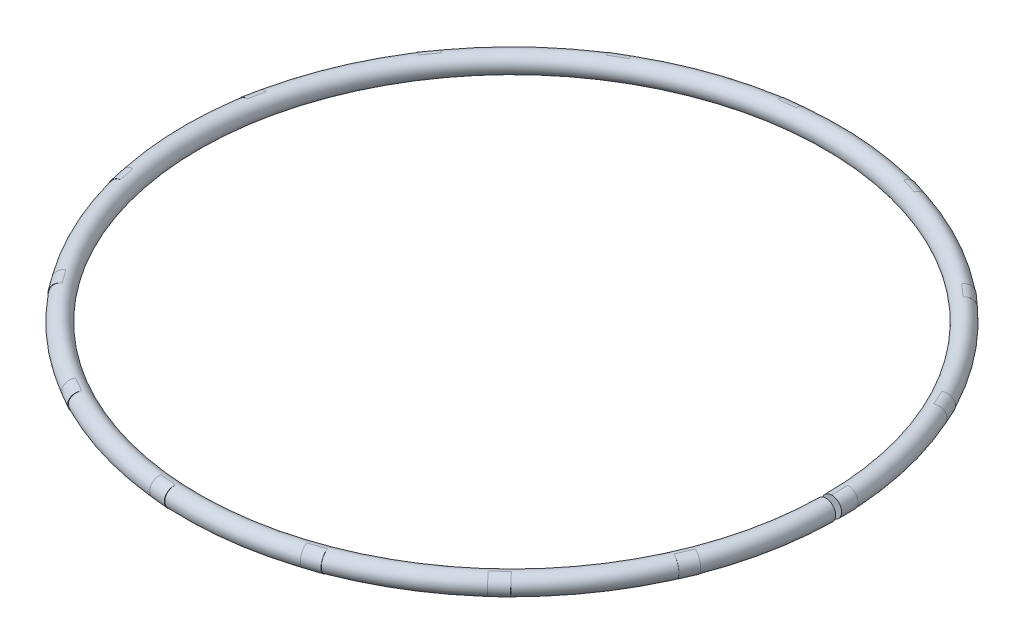
ISO-10303-21;
HEADER;
FILE_DESCRIPTION(('STEP AP214'),'2;1');
FILE_NAME('part.step','',(''),(''),'','','');
FILE_SCHEMA(('AUTOMOTIVE_DESIGN { 1 0 10303 214 1 1 1 1 }'));
ENDSEC;
DATA;
#1=APPLICATION_CONTEXT('core data for automotive mechanical design processes');
#2=APPLICATION_PROTOCOL_DEFINITION('international standard','automotive_design',2000,#1);
#3=PRODUCT_CONTEXT('',#1,'mechanical');
#4=PRODUCT('Part','Part','',(#3));
#5=PRODUCT_RELATED_PRODUCT_CATEGORY('part','',(#4));
#6=PRODUCT_DEFINITION_FORMATION('','',#4);
#7=PRODUCT_DEFINITION_CONTEXT('part definition',#1,'design');
#8=PRODUCT_DEFINITION('design','',#6,#7);
#9=PRODUCT_DEFINITION_SHAPE('','',#8);
#10=(LENGTH_UNIT() NAMED_UNIT(*) SI_UNIT(.MILLI.,.METRE.));
#11=(NAMED_UNIT(*) PLANE_ANGLE_UNIT() SI_UNIT($,.RADIAN.));
#12=(NAMED_UNIT(*) SI_UNIT($,.STERADIAN.) SOLID_ANGLE_UNIT());
#13=UNCERTAINTY_MEASURE_WITH_UNIT(LENGTH_MEASURE(1.E-05),#10,'distance_accuracy_value','');
#14=(GEOMETRIC_REPRESENTATION_CONTEXT(3) GLOBAL_UNCERTAINTY_ASSIGNED_CONTEXT((#13)) GLOBAL_UNIT_ASSIGNED_CONTEXT((#10,
#11,#12)) REPRESENTATION_CONTEXT('',''));
#15=CARTESIAN_POINT('',(0.,0.,0.));
#16=DIRECTION('',(0.,0.,1.));
#17=DIRECTION('',(1.,0.,0.));
#18=AXIS2_PLACEMENT_3D('',#15,#16,#17);
#19=CARTESIAN_POINT('',(17.407399780955,0.,-8.84490999762049));
#20=DIRECTION('',(0.406736643075789,0.,0.913545457642606));
#21=DIRECTION('',(0.913545457642606,0.,-0.406736643075789));
#22=AXIS2_PLACEMENT_3D('',#19,#20,#21);
#23=CYLINDRICAL_SURFACE('',#22,0.599999999999993);
#24=CARTESIAN_POINT('',(17.407399780955,0.,-8.84490999762049));
#25=DIRECTION('',(0.406736643075789,0.,0.913545457642606));
#26=DIRECTION('',(0.913545457642606,0.,-0.406736643075789));
#27=AXIS2_PLACEMENT_3D('',#24,#25,#26);
#28=CIRCLE('',#27,0.599999999999993);
#29=CARTESIAN_POINT('',(17.9555270555406,0.,-9.08895198346596));
#30=VERTEX_POINT('',#29);
#31=EDGE_CURVE('E11',#30,#30,#28,.T.);
#32=ORIENTED_EDGE('',*,*,#31,.T.);
#33=EDGE_LOOP('',(#32));
#34=FACE_BOUND('',#33,.T.);
#35=CARTESIAN_POINT('',(17.8141364240308,0.,-7.93136453997788));
#36=DIRECTION('',(0.406736643075789,0.,0.913545457642606));
#37=DIRECTION('',(0.913545457642606,0.,-0.406736643075789));
#38=AXIS2_PLACEMENT_3D('',#35,#36,#37);
#39=CIRCLE('',#38,0.599999999999993);
#40=CARTESIAN_POINT('',(18.3622636986164,0.,-8.17540652582335));
#41=VERTEX_POINT('',#40);
#42=EDGE_CURVE('E45',#41,#41,#39,.T.);
#43=ORIENTED_EDGE('',*,*,#42,.F.);
#44=EDGE_LOOP('',(#43));
#45=FACE_BOUND('',#44,.T.);
#46=ADVANCED_FACE('F42',(#34,#45),#23,.T.);
#47=CARTESIAN_POINT('',(17.407399780955,0.,-8.84490999762049));
#48=DIRECTION('',(0.406736643075789,0.,0.913545457642606));
#49=DIRECTION('',(0.913545457642606,0.,-0.406736643075789));
#50=AXIS2_PLACEMENT_3D('',#47,#48,#49);
#51=PLANE('',#50);
#52=ORIENTED_EDGE('',*,*,#31,.F.);
#53=EDGE_LOOP('',(#52));
#54=FACE_BOUND('',#53,.T.);
#55=ADVANCED_FACE('F57',(#54),#51,.F.);
#56=CARTESIAN_POINT('',(17.8141364240308,0.,-7.93136453997788));
#57=DIRECTION('',(0.406736643075789,0.,0.913545457642606));
#58=DIRECTION('',(0.913545457642606,0.,-0.406736643075789));
#59=AXIS2_PLACEMENT_3D('',#56,#57,#58);
#60=PLANE('',#59);
#61=ORIENTED_EDGE('',*,*,#42,.T.);
#62=EDGE_LOOP('',(#61));
#63=FACE_BOUND('',#62,.T.);
#64=ADVANCED_FACE('F54',(#63),#60,.T.);
#65=CLOSED_SHELL('',(#46,#55,#64));
#66=MANIFOLD_SOLID_BREP('B2',#65);
#67=CARTESIAN_POINT('',(12.3049019985205,0.,-15.1604547031679));
#68=DIRECTION('',(0.743144825477386,0.,0.669130606358867));
#69=DIRECTION('',(0.669130606358867,0.,-0.743144825477386));
#70=AXIS2_PLACEMENT_3D('',#67,#68,#69);
#71=CYLINDRICAL_SURFACE('',#70,0.599999999999993);
#72=CARTESIAN_POINT('',(12.3049019985205,0.,-15.1604547031679));
#73=DIRECTION('',(0.743144825477386,0.,0.669130606358867));
#74=DIRECTION('',(0.669130606358867,0.,-0.743144825477386));
#75=AXIS2_PLACEMENT_3D('',#72,#73,#74);
#76=CIRCLE('',#75,0.599999999999993);
#77=CARTESIAN_POINT('',(12.7063803623358,0.,-15.6063415984543));
#78=VERTEX_POINT('',#77);
#79=EDGE_CURVE('E41',#78,#78,#76,.T.);
#80=ORIENTED_EDGE('',*,*,#79,.T.);
#81=EDGE_LOOP('',(#80));
#82=FACE_BOUND('',#81,.T.);
#83=CARTESIAN_POINT('',(13.0480468239979,0.,-14.491324096809));
#84=DIRECTION('',(0.743144825477386,0.,0.669130606358867));
#85=DIRECTION('',(0.669130606358867,0.,-0.743144825477386));
#86=AXIS2_PLACEMENT_3D('',#83,#84,#85);
#87=CIRCLE('',#86,0.599999999999993);
#88=CARTESIAN_POINT('',(13.4495251878132,0.,-14.9372109920955));
#89=VERTEX_POINT('',#88);
#90=EDGE_CURVE('E94',#89,#89,#87,.T.);
#91=ORIENTED_EDGE('',*,*,#90,.F.);
#92=EDGE_LOOP('',(#91));
#93=FACE_BOUND('',#92,.T.);
#94=ADVANCED_FACE('F91',(#82,#93),#71,.T.);
#95=CARTESIAN_POINT('',(12.3049019985205,0.,-15.1604547031679));
#96=DIRECTION('',(0.743144825477386,0.,0.669130606358867));
#97=DIRECTION('',(0.669130606358867,0.,-0.743144825477386));
#98=AXIS2_PLACEMENT_3D('',#95,#96,#97);
#99=PLANE('',#98);
#100=ORIENTED_EDGE('',*,*,#79,.F.);
#101=EDGE_LOOP('',(#100));
#102=FACE_BOUND('',#101,.T.);
#103=ADVANCED_FACE('F106',(#102),#99,.F.);
#104=CARTESIAN_POINT('',(13.0480468239979,0.,-14.491324096809));
#105=DIRECTION('',(0.743144825477386,0.,0.669130606358867));
#106=DIRECTION('',(0.669130606358867,0.,-0.743144825477386));
#107=AXIS2_PLACEMENT_3D('',#104,#105,#106);
#108=PLANE('',#107);
#109=ORIENTED_EDGE('',*,*,#90,.T.);
#110=EDGE_LOOP('',(#109));
#111=FACE_BOUND('',#110,.T.);
#112=ADVANCED_FACE('F103',(#111),#108,.T.);
#113=CLOSED_SHELL('',(#94,#103,#112));
#114=MANIFOLD_SOLID_BREP('B6',#113);
#115=CARTESIAN_POINT('',(5.07477487401652,0.,-18.8546190621304));
#116=DIRECTION('',(0.95105651629515,0.,0.309016994374957));
#117=DIRECTION('',(0.309016994374957,0.,-0.95105651629515));
#118=AXIS2_PLACEMENT_3D('',#115,#116,#117);
#119=CYLINDRICAL_SURFACE('',#118,0.599999999999993);
#120=CARTESIAN_POINT('',(5.07477487401652,0.,-18.8546190621304));
#121=DIRECTION('',(0.95105651629515,0.,0.309016994374957));
#122=DIRECTION('',(0.309016994374957,0.,-0.95105651629515));
#123=AXIS2_PLACEMENT_3D('',#120,#121,#122);
#124=CIRCLE('',#123,0.599999999999993);
#125=CARTESIAN_POINT('',(5.26018507064149,0.,-19.4252529719075));
#126=VERTEX_POINT('',#125);
#127=EDGE_CURVE('E90',#126,#126,#124,.T.);
#128=ORIENTED_EDGE('',*,*,#127,.T.);
#129=EDGE_LOOP('',(#128));
#130=FACE_BOUND('',#129,.T.);
#131=CARTESIAN_POINT('',(6.02583139031167,0.,-18.5456020677554));
#132=DIRECTION('',(0.95105651629515,0.,0.309016994374957));
#133=DIRECTION('',(0.309016994374957,0.,-0.95105651629515));
#134=AXIS2_PLACEMENT_3D('',#131,#132,#133);
#135=CIRCLE('',#134,0.599999999999993);
#136=CARTESIAN_POINT('',(6.21124158693664,0.,-19.1162359775325));
#137=VERTEX_POINT('',#136);
#138=EDGE_CURVE('E143',#137,#137,#135,.T.);
#139=ORIENTED_EDGE('',*,*,#138,.F.);
#140=EDGE_LOOP('',(#139));
#141=FACE_BOUND('',#140,.T.);
#142=ADVANCED_FACE('F140',(#130,#141),#119,.T.);
#143=CARTESIAN_POINT('',(5.07477487401652,0.,-18.8546190621304));
#144=DIRECTION('',(0.95105651629515,0.,0.309016994374957));
#145=DIRECTION('',(0.309016994374957,0.,-0.95105651629515));
#146=AXIS2_PLACEMENT_3D('',#143,#144,#145);
#147=PLANE('',#146);
#148=ORIENTED_EDGE('',*,*,#127,.F.);
#149=EDGE_LOOP('',(#148));
#150=FACE_BOUND('',#149,.T.);
#151=ADVANCED_FACE('F155',(#150),#147,.F.);
#152=CARTESIAN_POINT('',(6.02583139031167,0.,-18.5456020677554));
#153=DIRECTION('',(0.95105651629515,0.,0.309016994374957));
#154=DIRECTION('',(0.309016994374957,0.,-0.95105651629515));
#155=AXIS2_PLACEMENT_3D('',#152,#153,#154);
#156=PLANE('',#155);
#157=ORIENTED_EDGE('',*,*,#138,.T.);
#158=EDGE_LOOP('',(#157));
#159=FACE_BOUND('',#158,.T.);
#160=ADVANCED_FACE('F152',(#159),#156,.T.);
#161=CLOSED_SHELL('',(#142,#151,#160));
#162=MANIFOLD_SOLID_BREP('B36',#161);
#163=CARTESIAN_POINT('',(-3.03282692908733,0.,-19.2886484964137));
#164=DIRECTION('',(0.994521895368274,0.,-0.104528463267644));
#165=DIRECTION('',(-0.104528463267644,0.,-0.994521895368274));
#166=AXIS2_PLACEMENT_3D('',#163,#164,#165);
#167=CYLINDRICAL_SURFACE('',#166,0.599999999999993);
#168=CARTESIAN_POINT('',(-3.03282692908733,0.,-19.2886484964137));
#169=DIRECTION('',(0.994521895368274,0.,-0.104528463267644));
#170=DIRECTION('',(-0.104528463267644,0.,-0.994521895368274));
#171=AXIS2_PLACEMENT_3D('',#168,#169,#170);
#172=CIRCLE('',#171,0.599999999999993);
#173=CARTESIAN_POINT('',(-3.09554400704791,0.,-19.8853616336347));
#174=VERTEX_POINT('',#173);
#175=EDGE_CURVE('E139',#174,#174,#172,.T.);
#176=ORIENTED_EDGE('',*,*,#175,.T.);
#177=EDGE_LOOP('',(#176));
#178=FACE_BOUND('',#177,.T.);
#179=CARTESIAN_POINT('',(-2.03830503371905,0.,-19.3931769596813));
#180=DIRECTION('',(0.994521895368274,0.,-0.104528463267644));
#181=DIRECTION('',(-0.104528463267644,0.,-0.994521895368274));
#182=AXIS2_PLACEMENT_3D('',#179,#180,#181);
#183=CIRCLE('',#182,0.599999999999993);
#184=CARTESIAN_POINT('',(-2.10102211167964,0.,-19.9898900969023));
#185=VERTEX_POINT('',#184);
#186=EDGE_CURVE('E192',#185,#185,#183,.T.);
#187=ORIENTED_EDGE('',*,*,#186,.F.);
#188=EDGE_LOOP('',(#187));
#189=FACE_BOUND('',#188,.T.);
#190=ADVANCED_FACE('F189',(#178,#189),#167,.T.);
#191=CARTESIAN_POINT('',(-3.03282692908733,0.,-19.2886484964137));
#192=DIRECTION('',(0.994521895368274,0.,-0.104528463267644));
#193=DIRECTION('',(-0.104528463267644,0.,-0.994521895368274));
#194=AXIS2_PLACEMENT_3D('',#191,#192,#193);
#195=PLANE('',#194);
#196=ORIENTED_EDGE('',*,*,#175,.F.);
#197=EDGE_LOOP('',(#196));
#198=FACE_BOUND('',#197,.T.);
#199=ADVANCED_FACE('F204',(#198),#195,.F.);
#200=CARTESIAN_POINT('',(-2.03830503371905,0.,-19.3931769596813));
#201=DIRECTION('',(0.994521895368274,0.,-0.104528463267644));
#202=DIRECTION('',(-0.104528463267644,0.,-0.994521895368274));
#203=AXIS2_PLACEMENT_3D('',#200,#201,#202);
#204=PLANE('',#203);
#205=ORIENTED_EDGE('',*,*,#186,.T.);
#206=EDGE_LOOP('',(#205));
#207=FACE_BOUND('',#206,.T.);
#208=ADVANCED_FACE('F201',(#207),#204,.T.);
#209=CLOSED_SHELL('',(#190,#199,#208));
#210=MANIFOLD_SOLID_BREP('B85',#209);
#211=CARTESIAN_POINT('',(-10.6160254037843,0.,-16.3874953737967));
#212=DIRECTION('',(0.866025403784443,0.,-0.499999999999992));
#213=DIRECTION('',(-0.499999999999992,0.,-0.866025403784443));
#214=AXIS2_PLACEMENT_3D('',#211,#212,#213);
#215=CYLINDRICAL_SURFACE('',#214,0.599999999999993);
#216=CARTESIAN_POINT('',(-10.6160254037843,0.,-16.3874953737967));
#217=DIRECTION('',(0.866025403784443,0.,-0.499999999999992));
#218=DIRECTION('',(-0.499999999999992,0.,-0.866025403784443));
#219=AXIS2_PLACEMENT_3D('',#216,#217,#218);
#220=CIRCLE('',#219,0.599999999999993);
#221=CARTESIAN_POINT('',(-10.9160254037843,0.,-16.9071106160673));
#222=VERTEX_POINT('',#221);
#223=EDGE_CURVE('E188',#222,#222,#220,.T.);
#224=ORIENTED_EDGE('',*,*,#223,.T.);
#225=EDGE_LOOP('',(#224));
#226=FACE_BOUND('',#225,.T.);
#227=CARTESIAN_POINT('',(-9.74999999999984,0.,-16.8874953737966));
#228=DIRECTION('',(0.866025403784443,0.,-0.499999999999992));
#229=DIRECTION('',(-0.499999999999992,0.,-0.866025403784443));
#230=AXIS2_PLACEMENT_3D('',#227,#228,#229);
#231=CIRCLE('',#230,0.599999999999993);
#232=CARTESIAN_POINT('',(-10.0499999999998,0.,-17.4071106160673));
#233=VERTEX_POINT('',#232);
#234=EDGE_CURVE('E241',#233,#233,#231,.T.);
#235=ORIENTED_EDGE('',*,*,#234,.F.);
#236=EDGE_LOOP('',(#235));
#237=FACE_BOUND('',#236,.T.);
#238=ADVANCED_FACE('F238',(#226,#237),#215,.T.);
#239=CARTESIAN_POINT('',(-10.6160254037843,0.,-16.3874953737967));
#240=DIRECTION('',(0.866025403784443,0.,-0.499999999999992));
#241=DIRECTION('',(-0.499999999999992,0.,-0.866025403784443));
#242=AXIS2_PLACEMENT_3D('',#239,#240,#241);
#243=PLANE('',#242);
#244=ORIENTED_EDGE('',*,*,#223,.F.);
#245=EDGE_LOOP('',(#244));
#246=FACE_BOUND('',#245,.T.);
#247=ADVANCED_FACE('F253',(#246),#243,.F.);
#248=CARTESIAN_POINT('',(-9.74999999999984,0.,-16.8874953737966));
#249=DIRECTION('',(0.866025403784443,0.,-0.499999999999992));
#250=DIRECTION('',(-0.499999999999992,0.,-0.866025403784443));
#251=AXIS2_PLACEMENT_3D('',#248,#249,#250);
#252=PLANE('',#251);
#253=ORIENTED_EDGE('',*,*,#234,.T.);
#254=EDGE_LOOP('',(#253));
#255=FACE_BOUND('',#254,.T.);
#256=ADVANCED_FACE('F250',(#255),#252,.T.);
#257=CLOSED_SHELL('',(#238,#247,#256));
#258=MANIFOLD_SOLID_BREP('B134',#257);
#259=CARTESIAN_POINT('',(-16.3636166426039,0.,-10.6527954253284));
#260=DIRECTION('',(0.58778525229248,0.,-0.809016994374943));
#261=DIRECTION('',(-0.809016994374943,0.,-0.58778525229248));
#262=AXIS2_PLACEMENT_3D('',#259,#260,#261);
#263=CYLINDRICAL_SURFACE('',#262,0.599999999999993);
#264=CARTESIAN_POINT('',(-16.3636166426039,0.,-10.6527954253284));
#265=DIRECTION('',(0.58778525229248,0.,-0.809016994374943));
#266=DIRECTION('',(-0.809016994374943,0.,-0.58778525229248));
#267=AXIS2_PLACEMENT_3D('',#264,#265,#266);
#268=CIRCLE('',#267,0.599999999999993);
#269=CARTESIAN_POINT('',(-16.8490268392288,0.,-11.0054665767039));
#270=VERTEX_POINT('',#269);
#271=EDGE_CURVE('E237',#270,#270,#268,.T.);
#272=ORIENTED_EDGE('',*,*,#271,.T.);
#273=EDGE_LOOP('',(#272));
#274=FACE_BOUND('',#273,.T.);
#275=CARTESIAN_POINT('',(-15.7758313903114,0.,-11.4618124197034));
#276=DIRECTION('',(0.58778525229248,0.,-0.809016994374943));
#277=DIRECTION('',(-0.809016994374943,0.,-0.58778525229248));
#278=AXIS2_PLACEMENT_3D('',#275,#276,#277);
#279=CIRCLE('',#278,0.599999999999993);
#280=CARTESIAN_POINT('',(-16.2612415869363,0.,-11.8144835710788));
#281=VERTEX_POINT('',#280);
#282=EDGE_CURVE('E290',#281,#281,#279,.T.);
#283=ORIENTED_EDGE('',*,*,#282,.F.);
#284=EDGE_LOOP('',(#283));
#285=FACE_BOUND('',#284,.T.);
#286=ADVANCED_FACE('F287',(#274,#285),#263,.T.);
#287=CARTESIAN_POINT('',(-16.3636166426039,0.,-10.6527954253284));
#288=DIRECTION('',(0.58778525229248,0.,-0.809016994374943));
#289=DIRECTION('',(-0.809016994374943,0.,-0.58778525229248));
#290=AXIS2_PLACEMENT_3D('',#287,#288,#289);
#291=PLANE('',#290);
#292=ORIENTED_EDGE('',*,*,#271,.F.);
#293=EDGE_LOOP('',(#292));
#294=FACE_BOUND('',#293,.T.);
#295=ADVANCED_FACE('F302',(#294),#291,.F.);
#296=CARTESIAN_POINT('',(-15.7758313903114,0.,-11.4618124197034));
#297=DIRECTION('',(0.58778525229248,0.,-0.809016994374943));
#298=DIRECTION('',(-0.809016994374943,0.,-0.58778525229248));
#299=AXIS2_PLACEMENT_3D('',#296,#297,#298);
#300=PLANE('',#299);
#301=ORIENTED_EDGE('',*,*,#282,.T.);
#302=EDGE_LOOP('',(#301));
#303=FACE_BOUND('',#302,.T.);
#304=ADVANCED_FACE('F299',(#303),#300,.T.);
#305=CLOSED_SHELL('',(#286,#295,#304));
#306=MANIFOLD_SOLID_BREP('B183',#305);
#307=CARTESIAN_POINT('',(-19.2817899051269,0.,-3.07613037021264));
#308=DIRECTION('',(0.207911690817766,0.,-0.978147600733804));
#309=DIRECTION('',(-0.978147600733804,0.,-0.207911690817766));
#310=AXIS2_PLACEMENT_3D('',#307,#308,#309);
#311=CYLINDRICAL_SURFACE('',#310,0.599999999999993);
#312=CARTESIAN_POINT('',(-19.2817899051269,0.,-3.07613037021264));
#313=DIRECTION('',(0.207911690817766,0.,-0.978147600733804));
#314=DIRECTION('',(-0.978147600733804,0.,-0.207911690817766));
#315=AXIS2_PLACEMENT_3D('',#312,#313,#314);
#316=CIRCLE('',#315,0.599999999999993);
#317=CARTESIAN_POINT('',(-19.8686784655672,0.,-3.2008773847033));
#318=VERTEX_POINT('',#317);
#319=EDGE_CURVE('E286',#318,#318,#316,.T.);
#320=ORIENTED_EDGE('',*,*,#319,.T.);
#321=EDGE_LOOP('',(#320));
#322=FACE_BOUND('',#321,.T.);
#323=CARTESIAN_POINT('',(-19.0738782143092,0.,-4.05427797094645));
#324=DIRECTION('',(0.207911690817766,0.,-0.978147600733804));
#325=DIRECTION('',(-0.978147600733804,0.,-0.207911690817766));
#326=AXIS2_PLACEMENT_3D('',#323,#324,#325);
#327=CIRCLE('',#326,0.599999999999993);
#328=CARTESIAN_POINT('',(-19.6607667747495,0.,-4.1790249854371));
#329=VERTEX_POINT('',#328);
#330=EDGE_CURVE('E339',#329,#329,#327,.T.);
#331=ORIENTED_EDGE('',*,*,#330,.F.);
#332=EDGE_LOOP('',(#331));
#333=FACE_BOUND('',#332,.T.);
#334=ADVANCED_FACE('F336',(#322,#333),#311,.T.);
#335=CARTESIAN_POINT('',(-19.2817899051269,0.,-3.07613037021264));
#336=DIRECTION('',(0.207911690817766,0.,-0.978147600733804));
#337=DIRECTION('',(-0.978147600733804,0.,-0.207911690817766));
#338=AXIS2_PLACEMENT_3D('',#335,#336,#337);
#339=PLANE('',#338);
#340=ORIENTED_EDGE('',*,*,#319,.F.);
#341=EDGE_LOOP('',(#340));
#342=FACE_BOUND('',#341,.T.);
#343=ADVANCED_FACE('F351',(#342),#339,.F.);
#344=CARTESIAN_POINT('',(-19.0738782143092,0.,-4.05427797094645));
#345=DIRECTION('',(0.207911690817766,0.,-0.978147600733804));
#346=DIRECTION('',(-0.978147600733804,0.,-0.207911690817766));
#347=AXIS2_PLACEMENT_3D('',#344,#345,#346);
#348=PLANE('',#347);
#349=ORIENTED_EDGE('',*,*,#330,.T.);
#350=EDGE_LOOP('',(#349));
#351=FACE_BOUND('',#350,.T.);
#352=ADVANCED_FACE('F348',(#351),#348,.T.);
#353=CLOSED_SHELL('',(#334,#343,#352));
#354=MANIFOLD_SOLID_BREP('B232',#353);
#355=CARTESIAN_POINT('',(-18.8659665234915,0.,5.03242557167999));
#356=DIRECTION('',(-0.207911690817753,0.,-0.978147600733807));
#357=DIRECTION('',(-0.978147600733807,0.,0.207911690817753));
#358=AXIS2_PLACEMENT_3D('',#355,#356,#357);
#359=CYLINDRICAL_SURFACE('',#358,0.599999999999993);
#360=CARTESIAN_POINT('',(-18.8659665234915,0.,5.03242557167999));
#361=DIRECTION('',(-0.207911690817753,0.,-0.978147600733807));
#362=DIRECTION('',(-0.978147600733807,0.,0.207911690817753));
#363=AXIS2_PLACEMENT_3D('',#360,#361,#362);
#364=CIRCLE('',#363,0.599999999999993);
#365=CARTESIAN_POINT('',(-19.4528550839318,0.,5.15717258617065));
#366=VERTEX_POINT('',#365);
#367=EDGE_CURVE('E335',#366,#366,#364,.T.);
#368=ORIENTED_EDGE('',*,*,#367,.T.);
#369=EDGE_LOOP('',(#368));
#370=FACE_BOUND('',#369,.T.);
#371=CARTESIAN_POINT('',(-19.0738782143092,0.,4.05427797094619));
#372=DIRECTION('',(-0.207911690817753,0.,-0.978147600733807));
#373=DIRECTION('',(-0.978147600733807,0.,0.207911690817753));
#374=AXIS2_PLACEMENT_3D('',#371,#372,#373);
#375=CIRCLE('',#374,0.599999999999993);
#376=CARTESIAN_POINT('',(-19.6607667747495,0.,4.17902498543684));
#377=VERTEX_POINT('',#376);
#378=EDGE_CURVE('E388',#377,#377,#375,.T.);
#379=ORIENTED_EDGE('',*,*,#378,.F.);
#380=EDGE_LOOP('',(#379));
#381=FACE_BOUND('',#380,.T.);
#382=ADVANCED_FACE('F385',(#370,#381),#359,.T.);
#383=CARTESIAN_POINT('',(-18.8659665234915,0.,5.03242557167999));
#384=DIRECTION('',(-0.207911690817753,0.,-0.978147600733807));
#385=DIRECTION('',(-0.978147600733807,0.,0.207911690817753));
#386=AXIS2_PLACEMENT_3D('',#383,#384,#385);
#387=PLANE('',#386);
#388=ORIENTED_EDGE('',*,*,#367,.F.);
#389=EDGE_LOOP('',(#388));
#390=FACE_BOUND('',#389,.T.);
#391=ADVANCED_FACE('F400',(#390),#387,.F.);
#392=CARTESIAN_POINT('',(-19.0738782143092,0.,4.05427797094619));
#393=DIRECTION('',(-0.207911690817753,0.,-0.978147600733807));
#394=DIRECTION('',(-0.978147600733807,0.,0.207911690817753));
#395=AXIS2_PLACEMENT_3D('',#392,#393,#394);
#396=PLANE('',#395);
#397=ORIENTED_EDGE('',*,*,#378,.T.);
#398=EDGE_LOOP('',(#397));
#399=FACE_BOUND('',#398,.T.);
#400=ADVANCED_FACE('F397',(#399),#396,.T.);
#401=CLOSED_SHELL('',(#382,#391,#400));
#402=MANIFOLD_SOLID_BREP('B281',#401);
#403=CARTESIAN_POINT('',(-15.1880461380191,0.,12.2708294140781));
#404=DIRECTION('',(-0.587785252292469,0.,-0.80901699437495));
#405=DIRECTION('',(-0.80901699437495,0.,0.587785252292469));
#406=AXIS2_PLACEMENT_3D('',#403,#404,#405);
#407=CYLINDRICAL_SURFACE('',#406,0.599999999999993);
#408=CARTESIAN_POINT('',(-15.1880461380191,0.,12.2708294140781));
#409=DIRECTION('',(-0.587785252292469,0.,-0.80901699437495));
#410=DIRECTION('',(-0.80901699437495,0.,0.587785252292469));
#411=AXIS2_PLACEMENT_3D('',#408,#409,#410);
#412=CIRCLE('',#411,0.599999999999993);
#413=CARTESIAN_POINT('',(-15.673456334644,0.,12.6235005654536));
#414=VERTEX_POINT('',#413);
#415=EDGE_CURVE('E384',#414,#414,#412,.T.);
#416=ORIENTED_EDGE('',*,*,#415,.T.);
#417=EDGE_LOOP('',(#416));
#418=FACE_BOUND('',#417,.T.);
#419=CARTESIAN_POINT('',(-15.7758313903115,0.,11.4618124197031));
#420=DIRECTION('',(-0.587785252292469,0.,-0.80901699437495));
#421=DIRECTION('',(-0.80901699437495,0.,0.587785252292469));
#422=AXIS2_PLACEMENT_3D('',#419,#420,#421);
#423=CIRCLE('',#422,0.599999999999993);
#424=CARTESIAN_POINT('',(-16.2612415869365,0.,11.8144835710786));
#425=VERTEX_POINT('',#424);
#426=EDGE_CURVE('E437',#425,#425,#423,.T.);
#427=ORIENTED_EDGE('',*,*,#426,.F.);
#428=EDGE_LOOP('',(#427));
#429=FACE_BOUND('',#428,.T.);
#430=ADVANCED_FACE('F434',(#418,#429),#407,.T.);
#431=CARTESIAN_POINT('',(-15.1880461380191,0.,12.2708294140781));
#432=DIRECTION('',(-0.587785252292469,0.,-0.80901699437495));
#433=DIRECTION('',(-0.80901699437495,0.,0.587785252292469));
#434=AXIS2_PLACEMENT_3D('',#431,#432,#433);
#435=PLANE('',#434);
#436=ORIENTED_EDGE('',*,*,#415,.F.);
#437=EDGE_LOOP('',(#436));
#438=FACE_BOUND('',#437,.T.);
#439=ADVANCED_FACE('F449',(#438),#435,.F.);
#440=CARTESIAN_POINT('',(-15.7758313903115,0.,11.4618124197031));
#441=DIRECTION('',(-0.587785252292469,0.,-0.80901699437495));
#442=DIRECTION('',(-0.80901699437495,0.,0.587785252292469));
#443=AXIS2_PLACEMENT_3D('',#440,#441,#442);
#444=PLANE('',#443);
#445=ORIENTED_EDGE('',*,*,#426,.T.);
#446=EDGE_LOOP('',(#445));
#447=FACE_BOUND('',#446,.T.);
#448=ADVANCED_FACE('F446',(#447),#444,.T.);
#449=CLOSED_SHELL('',(#430,#439,#448));
#450=MANIFOLD_SOLID_BREP('B330',#449);
#451=CARTESIAN_POINT('',(-8.88397459621564,0.,17.3874953737965));
#452=DIRECTION('',(-0.866025403784436,0.,-0.500000000000004));
#453=DIRECTION('',(-0.500000000000004,0.,0.866025403784436));
#454=AXIS2_PLACEMENT_3D('',#451,#452,#453);
#455=CYLINDRICAL_SURFACE('',#454,0.599999999999993);
#456=CARTESIAN_POINT('',(-8.88397459621564,0.,17.3874953737965));
#457=DIRECTION('',(-0.866025403784436,0.,-0.500000000000004));
#458=DIRECTION('',(-0.500000000000004,0.,0.866025403784436));
#459=AXIS2_PLACEMENT_3D('',#456,#457,#458);
#460=CIRCLE('',#459,0.599999999999993);
#461=CARTESIAN_POINT('',(-9.18397459621564,0.,17.9071106160672));
#462=VERTEX_POINT('',#461);
#463=EDGE_CURVE('E433',#462,#462,#460,.T.);
#464=ORIENTED_EDGE('',*,*,#463,.T.);
#465=EDGE_LOOP('',(#464));
#466=FACE_BOUND('',#465,.T.);
#467=CARTESIAN_POINT('',(-9.75000000000008,0.,16.8874953737965));
#468=DIRECTION('',(-0.866025403784436,0.,-0.500000000000004));
#469=DIRECTION('',(-0.500000000000004,0.,0.866025403784436));
#470=AXIS2_PLACEMENT_3D('',#467,#468,#469);
#471=CIRCLE('',#470,0.599999999999993);
#472=CARTESIAN_POINT('',(-10.0500000000001,0.,17.4071106160672));
#473=VERTEX_POINT('',#472);
#474=EDGE_CURVE('E486',#473,#473,#471,.T.);
#475=ORIENTED_EDGE('',*,*,#474,.F.);
#476=EDGE_LOOP('',(#475));
#477=FACE_BOUND('',#476,.T.);
#478=ADVANCED_FACE('F483',(#466,#477),#455,.T.);
#479=CARTESIAN_POINT('',(-8.88397459621564,0.,17.3874953737965));
#480=DIRECTION('',(-0.866025403784436,0.,-0.500000000000004));
#481=DIRECTION('',(-0.500000000000004,0.,0.866025403784436));
#482=AXIS2_PLACEMENT_3D('',#479,#480,#481);
#483=PLANE('',#482);
#484=ORIENTED_EDGE('',*,*,#463,.F.);
#485=EDGE_LOOP('',(#484));
#486=FACE_BOUND('',#485,.T.);
#487=ADVANCED_FACE('F498',(#486),#483,.F.);
#488=CARTESIAN_POINT('',(-9.75000000000008,0.,16.8874953737965));
#489=DIRECTION('',(-0.866025403784436,0.,-0.500000000000004));
#490=DIRECTION('',(-0.500000000000004,0.,0.866025403784436));
#491=AXIS2_PLACEMENT_3D('',#488,#489,#490);
#492=PLANE('',#491);
#493=ORIENTED_EDGE('',*,*,#474,.T.);
#494=EDGE_LOOP('',(#493));
#495=FACE_BOUND('',#494,.T.);
#496=ADVANCED_FACE('F495',(#495),#492,.T.);
#497=CLOSED_SHELL('',(#478,#487,#496));
#498=MANIFOLD_SOLID_BREP('B379',#497);
#499=CARTESIAN_POINT('',(-1.04378313835104,0.,19.497705422949));
#500=DIRECTION('',(-0.994521895368273,0.,-0.104528463267657));
#501=DIRECTION('',(-0.104528463267657,0.,0.994521895368273));
#502=AXIS2_PLACEMENT_3D('',#499,#500,#501);
#503=CYLINDRICAL_SURFACE('',#502,0.599999999999993);
#504=CARTESIAN_POINT('',(-1.04378313835104,0.,19.497705422949));
#505=DIRECTION('',(-0.994521895368273,0.,-0.104528463267657));
#506=DIRECTION('',(-0.104528463267657,0.,0.994521895368273));
#507=AXIS2_PLACEMENT_3D('',#504,#505,#506);
#508=CIRCLE('',#507,0.599999999999993);
#509=CARTESIAN_POINT('',(-1.10650021631163,0.,20.0944185601699));
#510=VERTEX_POINT('',#509);
#511=EDGE_CURVE('E482',#510,#510,#508,.T.);
#512=ORIENTED_EDGE('',*,*,#511,.T.);
#513=EDGE_LOOP('',(#512));
#514=FACE_BOUND('',#513,.T.);
#515=CARTESIAN_POINT('',(-2.03830503371931,0.,19.3931769596813));
#516=DIRECTION('',(-0.994521895368273,0.,-0.104528463267657));
#517=DIRECTION('',(-0.104528463267657,0.,0.994521895368273));
#518=AXIS2_PLACEMENT_3D('',#515,#516,#517);
#519=CIRCLE('',#518,0.599999999999993);
#520=CARTESIAN_POINT('',(-2.10102211167991,0.,19.9898900969023));
#521=VERTEX_POINT('',#520);
#522=EDGE_CURVE('E535',#521,#521,#519,.T.);
#523=ORIENTED_EDGE('',*,*,#522,.F.);
#524=EDGE_LOOP('',(#523));
#525=FACE_BOUND('',#524,.T.);
#526=ADVANCED_FACE('F532',(#514,#525),#503,.T.);
#527=CARTESIAN_POINT('',(-1.04378313835104,0.,19.497705422949));
#528=DIRECTION('',(-0.994521895368273,0.,-0.104528463267657));
#529=DIRECTION('',(-0.104528463267657,0.,0.994521895368273));
#530=AXIS2_PLACEMENT_3D('',#527,#528,#529);
#531=PLANE('',#530);
#532=ORIENTED_EDGE('',*,*,#511,.F.);
#533=EDGE_LOOP('',(#532));
#534=FACE_BOUND('',#533,.T.);
#535=ADVANCED_FACE('F547',(#534),#531,.F.);
#536=CARTESIAN_POINT('',(-2.03830503371931,0.,19.3931769596813));
#537=DIRECTION('',(-0.994521895368273,0.,-0.104528463267657));
#538=DIRECTION('',(-0.104528463267657,0.,0.994521895368273));
#539=AXIS2_PLACEMENT_3D('',#536,#537,#538);
#540=PLANE('',#539);
#541=ORIENTED_EDGE('',*,*,#522,.T.);
#542=EDGE_LOOP('',(#541));
#543=FACE_BOUND('',#542,.T.);
#544=ADVANCED_FACE('F544',(#543),#540,.T.);
#545=CLOSED_SHELL('',(#526,#535,#544));
#546=MANIFOLD_SOLID_BREP('B428',#545);
#547=CARTESIAN_POINT('',(6.97688790660658,0.,18.2365850733806));
#548=DIRECTION('',(-0.951056516295154,0.,0.309016994374945));
#549=DIRECTION('',(0.309016994374945,0.,0.951056516295154));
#550=AXIS2_PLACEMENT_3D('',#547,#548,#549);
#551=CYLINDRICAL_SURFACE('',#550,0.599999999999993);
#552=CARTESIAN_POINT('',(6.97688790660658,0.,18.2365850733806));
#553=DIRECTION('',(-0.951056516295154,0.,0.309016994374945));
#554=DIRECTION('',(0.309016994374945,0.,0.951056516295154));
#555=AXIS2_PLACEMENT_3D('',#552,#553,#554);
#556=CIRCLE('',#555,0.599999999999993);
#557=CARTESIAN_POINT('',(7.16229810323155,0.,18.8072189831577));
#558=VERTEX_POINT('',#557);
#559=EDGE_CURVE('E531',#558,#558,#556,.T.);
#560=ORIENTED_EDGE('',*,*,#559,.T.);
#561=EDGE_LOOP('',(#560));
#562=FACE_BOUND('',#561,.T.);
#563=CARTESIAN_POINT('',(6.02583139031143,0.,18.5456020677555));
#564=DIRECTION('',(-0.951056516295154,0.,0.309016994374945));
#565=DIRECTION('',(0.309016994374945,0.,0.951056516295154));
#566=AXIS2_PLACEMENT_3D('',#563,#564,#565);
#567=CIRCLE('',#566,0.599999999999993);
#568=CARTESIAN_POINT('',(6.21124158693639,0.,19.1162359775326));
#569=VERTEX_POINT('',#568);
#570=EDGE_CURVE('E584',#569,#569,#567,.T.);
#571=ORIENTED_EDGE('',*,*,#570,.F.);
#572=EDGE_LOOP('',(#571));
#573=FACE_BOUND('',#572,.T.);
#574=ADVANCED_FACE('F581',(#562,#573),#551,.T.);
#575=CARTESIAN_POINT('',(6.97688790660658,0.,18.2365850733806));
#576=DIRECTION('',(-0.951056516295154,0.,0.309016994374945));
#577=DIRECTION('',(0.309016994374945,0.,0.951056516295154));
#578=AXIS2_PLACEMENT_3D('',#575,#576,#577);
#579=PLANE('',#578);
#580=ORIENTED_EDGE('',*,*,#559,.F.);
#581=EDGE_LOOP('',(#580));
#582=FACE_BOUND('',#581,.T.);
#583=ADVANCED_FACE('F596',(#582),#579,.F.);
#584=CARTESIAN_POINT('',(6.02583139031143,0.,18.5456020677555));
#585=DIRECTION('',(-0.951056516295154,0.,0.309016994374945));
#586=DIRECTION('',(0.309016994374945,0.,0.951056516295154));
#587=AXIS2_PLACEMENT_3D('',#584,#585,#586);
#588=PLANE('',#587);
#589=ORIENTED_EDGE('',*,*,#570,.T.);
#590=EDGE_LOOP('',(#589));
#591=FACE_BOUND('',#590,.T.);
#592=ADVANCED_FACE('F593',(#591),#588,.T.);
#593=CLOSED_SHELL('',(#574,#583,#592));
#594=MANIFOLD_SOLID_BREP('B477',#593);
#595=CARTESIAN_POINT('',(13.7911916494751,0.,13.8221934904504));
#596=DIRECTION('',(-0.743144825477395,0.,0.669130606358857));
#597=DIRECTION('',(0.669130606358857,0.,0.743144825477395));
#598=AXIS2_PLACEMENT_3D('',#595,#596,#597);
#599=CYLINDRICAL_SURFACE('',#598,0.599999999999993);
#600=CARTESIAN_POINT('',(13.7911916494751,0.,13.8221934904504));
#601=DIRECTION('',(-0.743144825477395,0.,0.669130606358857));
#602=DIRECTION('',(0.669130606358857,0.,0.743144825477395));
#603=AXIS2_PLACEMENT_3D('',#600,#601,#602);
#604=CIRCLE('',#603,0.599999999999993);
#605=CARTESIAN_POINT('',(14.1926700132904,0.,14.2680803857368));
#606=VERTEX_POINT('',#605);
#607=EDGE_CURVE('E580',#606,#606,#604,.T.);
#608=ORIENTED_EDGE('',*,*,#607,.T.);
#609=EDGE_LOOP('',(#608));
#610=FACE_BOUND('',#609,.T.);
#611=CARTESIAN_POINT('',(13.0480468239977,0.,14.4913240968092));
#612=DIRECTION('',(-0.743144825477395,0.,0.669130606358857));
#613=DIRECTION('',(0.669130606358857,0.,0.743144825477395));
#614=AXIS2_PLACEMENT_3D('',#611,#612,#613);
#615=CIRCLE('',#614,0.599999999999993);
#616=CARTESIAN_POINT('',(13.449525187813,0.,14.9372109920956));
#617=VERTEX_POINT('',#616);
#618=EDGE_CURVE('E633',#617,#617,#615,.T.);
#619=ORIENTED_EDGE('',*,*,#618,.F.);
#620=EDGE_LOOP('',(#619));
#621=FACE_BOUND('',#620,.T.);
#622=ADVANCED_FACE('F630',(#610,#621),#599,.T.);
#623=CARTESIAN_POINT('',(13.7911916494751,0.,13.8221934904504));
#624=DIRECTION('',(-0.743144825477395,0.,0.669130606358857));
#625=DIRECTION('',(0.669130606358857,0.,0.743144825477395));
#626=AXIS2_PLACEMENT_3D('',#623,#624,#625);
#627=PLANE('',#626);
#628=ORIENTED_EDGE('',*,*,#607,.F.);
#629=EDGE_LOOP('',(#628));
#630=FACE_BOUND('',#629,.T.);
#631=ADVANCED_FACE('F645',(#630),#627,.F.);
#632=CARTESIAN_POINT('',(13.0480468239977,0.,14.4913240968092));
#633=DIRECTION('',(-0.743144825477395,0.,0.669130606358857));
#634=DIRECTION('',(0.669130606358857,0.,0.743144825477395));
#635=AXIS2_PLACEMENT_3D('',#632,#633,#634);
#636=PLANE('',#635);
#637=ORIENTED_EDGE('',*,*,#618,.T.);
#638=EDGE_LOOP('',(#637));
#639=FACE_BOUND('',#638,.T.);
#640=ADVANCED_FACE('F642',(#639),#636,.T.);
#641=CLOSED_SHELL('',(#622,#631,#640));
#642=MANIFOLD_SOLID_BREP('B526',#641);
#643=CARTESIAN_POINT('',(18.2208730671065,0.,7.01781908233552));
#644=DIRECTION('',(-0.406736643075801,0.,0.913545457642601));
#645=DIRECTION('',(0.913545457642601,0.,0.406736643075801));
#646=AXIS2_PLACEMENT_3D('',#643,#644,#645);
#647=CYLINDRICAL_SURFACE('',#646,0.599999999999993);
#648=CARTESIAN_POINT('',(18.2208730671065,0.,7.01781908233552));
#649=DIRECTION('',(-0.406736643075801,0.,0.913545457642601));
#650=DIRECTION('',(0.913545457642601,0.,0.406736643075801));
#651=AXIS2_PLACEMENT_3D('',#648,#649,#650);
#652=CIRCLE('',#651,0.599999999999993);
#653=CARTESIAN_POINT('',(18.7690003416921,0.,7.261861068181));
#654=VERTEX_POINT('',#653);
#655=EDGE_CURVE('E629',#654,#654,#652,.T.);
#656=ORIENTED_EDGE('',*,*,#655,.T.);
#657=EDGE_LOOP('',(#656));
#658=FACE_BOUND('',#657,.T.);
#659=CARTESIAN_POINT('',(17.8141364240307,0.,7.93136453997812));
#660=DIRECTION('',(-0.406736643075801,0.,0.913545457642601));
#661=DIRECTION('',(0.913545457642601,0.,0.406736643075801));
#662=AXIS2_PLACEMENT_3D('',#659,#660,#661);
#663=CIRCLE('',#662,0.599999999999993);
#664=CARTESIAN_POINT('',(18.3622636986163,0.,8.1754065258236));
#665=VERTEX_POINT('',#664);
#666=EDGE_CURVE('E682',#665,#665,#663,.T.);
#667=ORIENTED_EDGE('',*,*,#666,.F.);
#668=EDGE_LOOP('',(#667));
#669=FACE_BOUND('',#668,.T.);
#670=ADVANCED_FACE('F679',(#658,#669),#647,.T.);
#671=CARTESIAN_POINT('',(18.2208730671065,0.,7.01781908233552));
#672=DIRECTION('',(-0.406736643075801,0.,0.913545457642601));
#673=DIRECTION('',(0.913545457642601,0.,0.406736643075801));
#674=AXIS2_PLACEMENT_3D('',#671,#672,#673);
#675=PLANE('',#674);
#676=ORIENTED_EDGE('',*,*,#655,.F.);
#677=EDGE_LOOP('',(#676));
#678=FACE_BOUND('',#677,.T.);
#679=ADVANCED_FACE('F694',(#678),#675,.F.);
#680=CARTESIAN_POINT('',(17.8141364240307,0.,7.93136453997812));
#681=DIRECTION('',(-0.406736643075801,0.,0.913545457642601));
#682=DIRECTION('',(0.913545457642601,0.,0.406736643075801));
#683=AXIS2_PLACEMENT_3D('',#680,#681,#682);
#684=PLANE('',#683);
#685=ORIENTED_EDGE('',*,*,#666,.T.);
#686=EDGE_LOOP('',(#685));
#687=FACE_BOUND('',#686,.T.);
#688=ADVANCED_FACE('F691',(#687),#684,.T.);
#689=CLOSED_SHELL('',(#670,#679,#688));
#690=MANIFOLD_SOLID_BREP('B575',#689);
#691=CARTESIAN_POINT('',(19.5,0.,-1.));
#692=DIRECTION('',(0.,0.,1.));
#693=DIRECTION('',(1.,0.,0.));
#694=AXIS2_PLACEMENT_3D('',#691,#692,#693);
#695=CYLINDRICAL_SURFACE('',#694,0.599999999999993);
#696=CARTESIAN_POINT('',(19.5,0.,-1.));
#697=DIRECTION('',(0.,0.,1.));
#698=DIRECTION('',(1.,0.,0.));
#699=AXIS2_PLACEMENT_3D('',#696,#697,#698);
#700=CIRCLE('',#699,0.599999999999993);
#701=CARTESIAN_POINT('',(20.1,0.,-1.));
#702=VERTEX_POINT('',#701);
#703=EDGE_CURVE('E678',#702,#702,#700,.T.);
#704=ORIENTED_EDGE('',*,*,#703,.T.);
#705=EDGE_LOOP('',(#704));
#706=FACE_BOUND('',#705,.T.);
#707=CARTESIAN_POINT('',(19.5,0.,0.));
#708=DIRECTION('',(0.,0.,1.));
#709=DIRECTION('',(1.,0.,0.));
#710=AXIS2_PLACEMENT_3D('',#707,#708,#709);
#711=CIRCLE('',#710,0.599999999999993);
#712=CARTESIAN_POINT('',(20.1,0.,0.));
#713=VERTEX_POINT('',#712);
#714=EDGE_CURVE('E730',#713,#713,#711,.T.);
#715=ORIENTED_EDGE('',*,*,#714,.F.);
#716=EDGE_LOOP('',(#715));
#717=FACE_BOUND('',#716,.T.);
#718=ADVANCED_FACE('F727',(#706,#717),#695,.T.);
#719=CARTESIAN_POINT('',(19.5,0.,-1.));
#720=DIRECTION('',(0.,0.,1.));
#721=DIRECTION('',(1.,0.,0.));
#722=AXIS2_PLACEMENT_3D('',#719,#720,#721);
#723=PLANE('',#722);
#724=ORIENTED_EDGE('',*,*,#703,.F.);
#725=EDGE_LOOP('',(#724));
#726=FACE_BOUND('',#725,.T.);
#727=ADVANCED_FACE('F742',(#726),#723,.F.);
#728=CARTESIAN_POINT('',(19.5,0.,0.));
#729=DIRECTION('',(0.,0.,1.));
#730=DIRECTION('',(1.,0.,0.));
#731=AXIS2_PLACEMENT_3D('',#728,#729,#730);
#732=PLANE('',#731);
#733=ORIENTED_EDGE('',*,*,#714,.T.);
#734=EDGE_LOOP('',(#733));
#735=FACE_BOUND('',#734,.T.);
#736=ADVANCED_FACE('F739',(#735),#732,.T.);
#737=CLOSED_SHELL('',(#718,#727,#736));
#738=MANIFOLD_SOLID_BREP('B624',#737);
#739=CARTESIAN_POINT('',(0.,0.,0.));
#740=DIRECTION('',(0.,-1.,0.));
#741=DIRECTION('',(0.,0.,-1.));
#742=AXIS2_PLACEMENT_3D('',#739,#740,#741);
#743=TOROIDAL_SURFACE('',#742,19.5,0.599999999999993);
#744=CARTESIAN_POINT('',(19.4970300555496,0.,0.340321925526752));
#745=DIRECTION('',(-0.0174524064372693,0.,0.999847695156391));
#746=DIRECTION('',(0.999847695156391,0.,0.0174524064372693));
#747=AXIS2_PLACEMENT_3D('',#744,#745,#746);
#748=CIRCLE('',#747,0.599999999999993);
#749=CARTESIAN_POINT('',(20.0969386726435,0.,0.350793369389114));
#750=VERTEX_POINT('',#749);
#751=EDGE_CURVE('E726',#750,#750,#748,.T.);
#752=CARTESIAN_POINT('',(19.5,0.,0.));
#753=DIRECTION('',(0.,0.,1.));
#754=DIRECTION('',(1.,0.,0.));
#755=AXIS2_PLACEMENT_3D('',#752,#753,#754);
#756=CIRCLE('',#755,0.599999999999993);
#757=CARTESIAN_POINT('',(20.1,0.,0.));
#758=VERTEX_POINT('',#757);
#759=EDGE_CURVE('E774',#758,#758,#756,.T.);
#760=CARTESIAN_POINT('',(0.,0.,0.));
#761=DIRECTION('',(0.,-1.,0.));
#762=DIRECTION('',(0.,0.,-1.));
#763=AXIS2_PLACEMENT_3D('',#760,#761,#762);
#764=CIRCLE('',#763,20.1);
#765=EDGE_CURVE('',#750,#758,#764,.T.);
#766=ORIENTED_EDGE('',*,*,#751,.T.);
#767=ORIENTED_EDGE('',*,*,#759,.F.);
#768=ORIENTED_EDGE('',*,*,#765,.T.);
#769=ORIENTED_EDGE('',*,*,#765,.F.);
#770=EDGE_LOOP('',(#766,#768,#767,#769));
#771=FACE_BOUND('',#770,.T.);
#772=ADVANCED_FACE('F768',(#771),#743,.T.);
#773=CARTESIAN_POINT('',(19.4970300555496,0.,0.340321925526752));
#774=DIRECTION('',(-0.0174524064372693,0.,0.999847695156391));
#775=DIRECTION('',(0.999847695156391,0.,0.0174524064372693));
#776=AXIS2_PLACEMENT_3D('',#773,#774,#775);
#777=PLANE('',#776);
#778=ORIENTED_EDGE('',*,*,#751,.F.);
#779=EDGE_LOOP('',(#778));
#780=FACE_BOUND('',#779,.T.);
#781=ADVANCED_FACE('F783',(#780),#777,.F.);
#782=CARTESIAN_POINT('',(19.5,0.,0.));
#783=DIRECTION('',(0.,0.,1.));
#784=DIRECTION('',(1.,0.,0.));
#785=AXIS2_PLACEMENT_3D('',#782,#783,#784);
#786=PLANE('',#785);
#787=ORIENTED_EDGE('',*,*,#759,.T.);
#788=EDGE_LOOP('',(#787));
#789=FACE_BOUND('',#788,.T.);
#790=ADVANCED_FACE('F780',(#789),#786,.T.);
#791=CLOSED_SHELL('',(#772,#781,#790));
#792=MANIFOLD_SOLID_BREP('B673',#791);
#793=ADVANCED_BREP_SHAPE_REPRESENTATION('',(#18,#66,#114,#162,#210,#258,#306,#354,#402,#450,
#498,#546,#594,#642,#690,#738,#792),#14);
#794=SHAPE_DEFINITION_REPRESENTATION(#9,#793);
ENDSEC;
END-ISO-10303-21;
